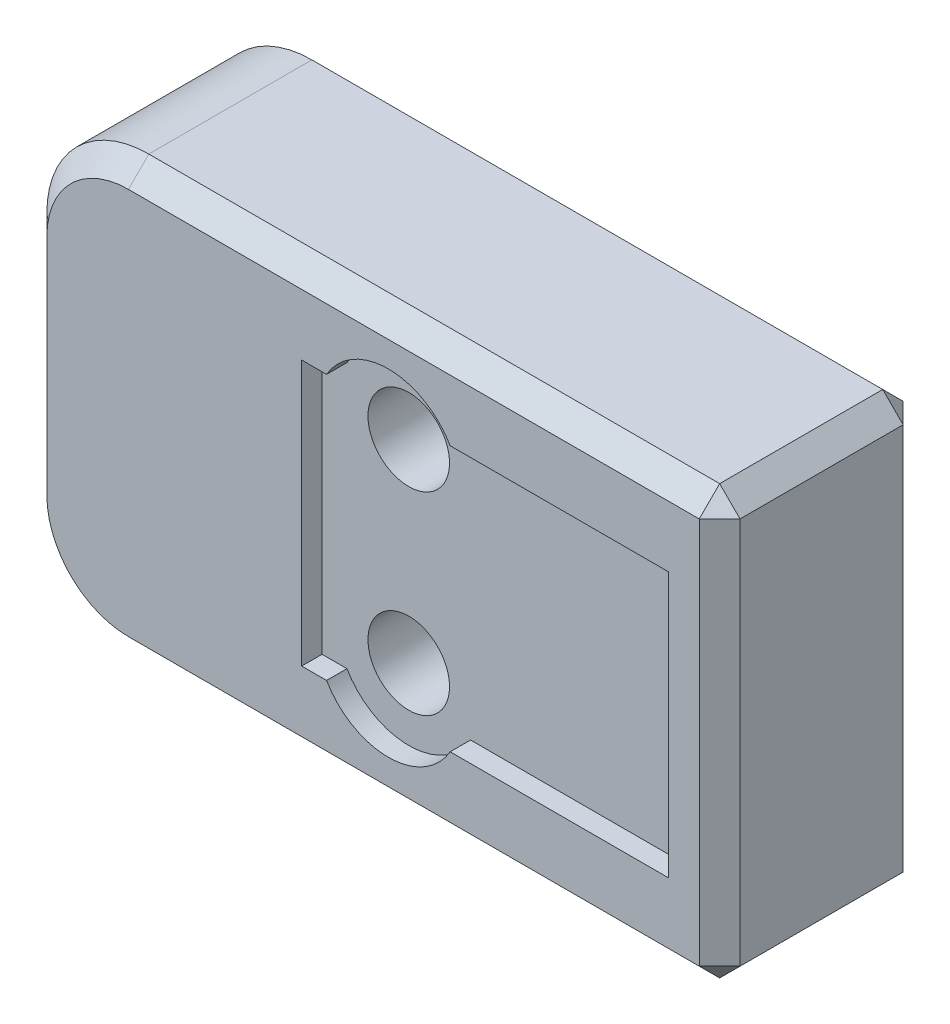
ISO-10303-21;
HEADER;
FILE_DESCRIPTION(('STEP AP214'),'2;1');
FILE_NAME('part.step','',(''),(''),'','','');
FILE_SCHEMA(('AUTOMOTIVE_DESIGN { 1 0 10303 214 1 1 1 1 }'));
ENDSEC;
DATA;
#1=APPLICATION_CONTEXT('core data for automotive mechanical design processes');
#2=APPLICATION_PROTOCOL_DEFINITION('international standard','automotive_design',2000,#1);
#3=PRODUCT_CONTEXT('',#1,'mechanical');
#4=PRODUCT('Part','Part','',(#3));
#5=PRODUCT_RELATED_PRODUCT_CATEGORY('part','',(#4));
#6=PRODUCT_DEFINITION_FORMATION('','',#4);
#7=PRODUCT_DEFINITION_CONTEXT('part definition',#1,'design');
#8=PRODUCT_DEFINITION('design','',#6,#7);
#9=PRODUCT_DEFINITION_SHAPE('','',#8);
#10=(LENGTH_UNIT() NAMED_UNIT(*) SI_UNIT(.MILLI.,.METRE.));
#11=(NAMED_UNIT(*) PLANE_ANGLE_UNIT() SI_UNIT($,.RADIAN.));
#12=(NAMED_UNIT(*) SI_UNIT($,.STERADIAN.) SOLID_ANGLE_UNIT());
#13=UNCERTAINTY_MEASURE_WITH_UNIT(LENGTH_MEASURE(1.E-05),#10,'distance_accuracy_value','');
#14=(GEOMETRIC_REPRESENTATION_CONTEXT(3) GLOBAL_UNCERTAINTY_ASSIGNED_CONTEXT((#13)) GLOBAL_UNIT_ASSIGNED_CONTEXT((#10,
#11,#12)) REPRESENTATION_CONTEXT('',''));
#15=CARTESIAN_POINT('',(0.,0.,0.));
#16=DIRECTION('',(0.,0.,1.));
#17=DIRECTION('',(1.,0.,0.));
#18=AXIS2_PLACEMENT_3D('',#15,#16,#17);
#19=CARTESIAN_POINT('',(-3.5,6.5,9.));
#20=DIRECTION('',(0.,-1.,0.));
#21=DIRECTION('',(1.,0.,0.));
#22=AXIS2_PLACEMENT_3D('',#19,#20,#21);
#23=PLANE('',#22);
#24=DIRECTION('',(0.,0.,-1.));
#25=VECTOR('',#24,1.);
#26=CARTESIAN_POINT('',(-2.28108891324553,6.5,10.));
#27=LINE('',#26,#25);
#28=CARTESIAN_POINT('',(-2.28108891324553,6.5,10.));
#29=VERTEX_POINT('',#28);
#30=CARTESIAN_POINT('',(-2.28108891324553,6.5,9.));
#31=VERTEX_POINT('',#30);
#32=EDGE_CURVE('E219',#29,#31,#27,.T.);
#33=ORIENTED_EDGE('',*,*,#32,.F.);
#34=DIRECTION('',(1.,0.,0.));
#35=VECTOR('',#34,1.);
#36=CARTESIAN_POINT('',(-3.5,6.5,10.));
#37=LINE('',#36,#35);
#38=CARTESIAN_POINT('',(-3.5,6.5,10.));
#39=VERTEX_POINT('',#38);
#40=EDGE_CURVE('E233',#39,#29,#37,.T.);
#41=ORIENTED_EDGE('',*,*,#40,.F.);
#42=DIRECTION('',(0.,0.,1.));
#43=VECTOR('',#42,1.);
#44=CARTESIAN_POINT('',(-3.5,6.5,9.));
#45=LINE('',#44,#43);
#46=CARTESIAN_POINT('',(-3.5,6.5,9.));
#47=VERTEX_POINT('',#46);
#48=EDGE_CURVE('E268',#47,#39,#45,.T.);
#49=ORIENTED_EDGE('',*,*,#48,.F.);
#50=DIRECTION('',(1.,0.,0.));
#51=VECTOR('',#50,1.);
#52=CARTESIAN_POINT('',(-3.5,6.5,9.));
#53=LINE('',#52,#51);
#54=EDGE_CURVE('E236',#47,#31,#53,.T.);
#55=ORIENTED_EDGE('',*,*,#54,.T.);
#56=EDGE_LOOP('',(#33,#41,#49,#55));
#57=FACE_BOUND('',#56,.T.);
#58=ADVANCED_FACE('F66',(#57),#23,.T.);
#59=CARTESIAN_POINT('',(14.5,-6.5,9.));
#60=DIRECTION('',(0.,1.,0.));
#61=DIRECTION('',(0.,0.,1.));
#62=AXIS2_PLACEMENT_3D('',#59,#60,#61);
#63=PLANE('',#62);
#64=DIRECTION('',(0.,0.,-1.));
#65=VECTOR('',#64,1.);
#66=CARTESIAN_POINT('',(3.78108891324554,-6.5,10.));
#67=LINE('',#66,#65);
#68=CARTESIAN_POINT('',(3.78108891324554,-6.5,10.));
#69=VERTEX_POINT('',#68);
#70=CARTESIAN_POINT('',(3.78108891324554,-6.5,9.));
#71=VERTEX_POINT('',#70);
#72=EDGE_CURVE('E343',#69,#71,#67,.T.);
#73=ORIENTED_EDGE('',*,*,#72,.F.);
#74=DIRECTION('',(-1.,0.,0.));
#75=VECTOR('',#74,1.);
#76=CARTESIAN_POINT('',(14.5,-6.5,10.));
#77=LINE('',#76,#75);
#78=CARTESIAN_POINT('',(14.5,-6.5,10.));
#79=VERTEX_POINT('',#78);
#80=EDGE_CURVE('E256',#79,#69,#77,.T.);
#81=ORIENTED_EDGE('',*,*,#80,.F.);
#82=DIRECTION('',(0.,0.,1.));
#83=VECTOR('',#82,1.);
#84=CARTESIAN_POINT('',(14.5,-6.5,9.));
#85=LINE('',#84,#83);
#86=CARTESIAN_POINT('',(14.5,-6.5,9.));
#87=VERTEX_POINT('',#86);
#88=EDGE_CURVE('E261',#87,#79,#85,.T.);
#89=ORIENTED_EDGE('',*,*,#88,.F.);
#90=DIRECTION('',(-1.,0.,0.));
#91=VECTOR('',#90,1.);
#92=CARTESIAN_POINT('',(14.5,-6.5,9.));
#93=LINE('',#92,#91);
#94=EDGE_CURVE('E414',#87,#71,#93,.T.);
#95=ORIENTED_EDGE('',*,*,#94,.T.);
#96=EDGE_LOOP('',(#73,#81,#89,#95));
#97=FACE_BOUND('',#96,.T.);
#98=ADVANCED_FACE('F435',(#97),#63,.T.);
#99=CARTESIAN_POINT('',(0.,0.,10.));
#100=DIRECTION('',(0.,0.,-1.));
#101=DIRECTION('',(-1.,0.,0.));
#102=AXIS2_PLACEMENT_3D('',#99,#100,#101);
#103=PLANE('',#102);
#104=DIRECTION('',(1.,0.,0.));
#105=VECTOR('',#104,1.);
#106=CARTESIAN_POINT('',(17.,-9.5,10.));
#107=LINE('',#106,#105);
#108=CARTESIAN_POINT('',(-12.,-9.5,10.));
#109=VERTEX_POINT('',#108);
#110=CARTESIAN_POINT('',(16.,-9.5,10.));
#111=VERTEX_POINT('',#110);
#112=EDGE_CURVE('E318',#109,#111,#107,.T.);
#113=ORIENTED_EDGE('',*,*,#112,.T.);
#114=DIRECTION('',(0.,1.,0.));
#115=VECTOR('',#114,1.);
#116=CARTESIAN_POINT('',(16.,10.5,10.));
#117=LINE('',#116,#115);
#118=CARTESIAN_POINT('',(16.,9.5,10.));
#119=VERTEX_POINT('',#118);
#120=EDGE_CURVE('E328',#111,#119,#117,.T.);
#121=ORIENTED_EDGE('',*,*,#120,.T.);
#122=DIRECTION('',(-1.,0.,0.));
#123=VECTOR('',#122,1.);
#124=CARTESIAN_POINT('',(-12.,9.5,10.));
#125=LINE('',#124,#123);
#126=CARTESIAN_POINT('',(-12.,9.5,10.));
#127=VERTEX_POINT('',#126);
#128=EDGE_CURVE('E326',#119,#127,#125,.T.);
#129=ORIENTED_EDGE('',*,*,#128,.T.);
#130=CARTESIAN_POINT('',(-12.,5.5,10.));
#131=DIRECTION('',(0.,0.,-1.));
#132=DIRECTION('',(-1.,0.,0.));
#133=AXIS2_PLACEMENT_3D('',#130,#131,#132);
#134=CIRCLE('',#133,4.);
#135=CARTESIAN_POINT('',(-16.,5.5,10.));
#136=VERTEX_POINT('',#135);
#137=EDGE_CURVE('E324',#127,#136,#134,.F.);
#138=ORIENTED_EDGE('',*,*,#137,.T.);
#139=DIRECTION('',(0.,-1.,0.));
#140=VECTOR('',#139,1.);
#141=CARTESIAN_POINT('',(-16.,-5.5,10.));
#142=LINE('',#141,#140);
#143=CARTESIAN_POINT('',(-16.,-5.5,10.));
#144=VERTEX_POINT('',#143);
#145=EDGE_CURVE('E322',#136,#144,#142,.T.);
#146=ORIENTED_EDGE('',*,*,#145,.T.);
#147=CARTESIAN_POINT('',(-12.,-5.5,10.));
#148=DIRECTION('',(0.,0.,-1.));
#149=DIRECTION('',(-1.,0.,0.));
#150=AXIS2_PLACEMENT_3D('',#147,#148,#149);
#151=CIRCLE('',#150,4.);
#152=EDGE_CURVE('E320',#144,#109,#151,.F.);
#153=ORIENTED_EDGE('',*,*,#152,.T.);
#154=EDGE_LOOP('',(#113,#121,#129,#138,#146,#153));
#155=FACE_BOUND('',#154,.T.);
#156=ORIENTED_EDGE('',*,*,#40,.T.);
#157=CARTESIAN_POINT('',(0.75,4.75,10.));
#158=DIRECTION('',(0.,0.,-1.));
#159=DIRECTION('',(0.,-1.,0.));
#160=AXIS2_PLACEMENT_3D('',#157,#158,#159);
#161=CIRCLE('',#160,3.5);
#162=CARTESIAN_POINT('',(3.78108891324553,6.5,10.));
#163=VERTEX_POINT('',#162);
#164=EDGE_CURVE('E216',#29,#163,#161,.T.);
#165=ORIENTED_EDGE('',*,*,#164,.T.);
#166=CARTESIAN_POINT('',(14.5,6.5,10.));
#167=VERTEX_POINT('',#166);
#168=EDGE_CURVE('E244',#163,#167,#37,.T.);
#169=ORIENTED_EDGE('',*,*,#168,.T.);
#170=DIRECTION('',(0.,-1.,0.));
#171=VECTOR('',#170,1.);
#172=CARTESIAN_POINT('',(14.5,6.5,10.));
#173=LINE('',#172,#171);
#174=EDGE_CURVE('E243',#167,#79,#173,.T.);
#175=ORIENTED_EDGE('',*,*,#174,.T.);
#176=ORIENTED_EDGE('',*,*,#80,.T.);
#177=CARTESIAN_POINT('',(0.75,-4.75,10.));
#178=DIRECTION('',(0.,0.,-1.));
#179=DIRECTION('',(0.,-1.,0.));
#180=AXIS2_PLACEMENT_3D('',#177,#178,#179);
#181=CIRCLE('',#180,3.5);
#182=CARTESIAN_POINT('',(-2.28108891324553,-6.5,10.));
#183=VERTEX_POINT('',#182);
#184=EDGE_CURVE('E237',#69,#183,#181,.T.);
#185=ORIENTED_EDGE('',*,*,#184,.T.);
#186=CARTESIAN_POINT('',(-3.5,-6.5,10.));
#187=VERTEX_POINT('',#186);
#188=EDGE_CURVE('E260',#183,#187,#77,.T.);
#189=ORIENTED_EDGE('',*,*,#188,.T.);
#190=DIRECTION('',(0.,1.,0.));
#191=VECTOR('',#190,1.);
#192=CARTESIAN_POINT('',(-3.5,-6.5,10.));
#193=LINE('',#192,#191);
#194=EDGE_CURVE('E241',#187,#39,#193,.T.);
#195=ORIENTED_EDGE('',*,*,#194,.T.);
#196=EDGE_LOOP('',(#156,#165,#169,#175,#176,#185,#189,#195));
#197=FACE_BOUND('',#196,.T.);
#198=ADVANCED_FACE('F239',(#155,#197),#103,.F.);
#199=CARTESIAN_POINT('',(-17.,-10.5,10.));
#200=DIRECTION('',(-1.,0.,0.));
#201=DIRECTION('',(0.,0.,1.));
#202=AXIS2_PLACEMENT_3D('',#199,#200,#201);
#203=PLANE('',#202);
#204=DIRECTION('',(0.,0.,-1.));
#205=VECTOR('',#204,1.);
#206=CARTESIAN_POINT('',(-17.,5.5,10.));
#207=LINE('',#206,#205);
#208=CARTESIAN_POINT('',(-17.,5.5,9.));
#209=VERTEX_POINT('',#208);
#210=CARTESIAN_POINT('',(-17.,5.5,1.));
#211=VERTEX_POINT('',#210);
#212=EDGE_CURVE('E278',#209,#211,#207,.T.);
#213=ORIENTED_EDGE('',*,*,#212,.T.);
#214=DIRECTION('',(0.,-1.,0.));
#215=VECTOR('',#214,1.);
#216=CARTESIAN_POINT('',(-17.,-10.5,1.));
#217=LINE('',#216,#215);
#218=CARTESIAN_POINT('',(-17.,-5.5,1.));
#219=VERTEX_POINT('',#218);
#220=EDGE_CURVE('E88',#211,#219,#217,.T.);
#221=ORIENTED_EDGE('',*,*,#220,.T.);
#222=DIRECTION('',(0.,0.,-1.));
#223=VECTOR('',#222,1.);
#224=CARTESIAN_POINT('',(-17.,-5.5,10.));
#225=LINE('',#224,#223);
#226=CARTESIAN_POINT('',(-17.,-5.5,9.));
#227=VERTEX_POINT('',#226);
#228=EDGE_CURVE('E276',#219,#227,#225,.F.);
#229=ORIENTED_EDGE('',*,*,#228,.T.);
#230=DIRECTION('',(0.,1.,0.));
#231=VECTOR('',#230,1.);
#232=CARTESIAN_POINT('',(-17.,5.5,9.));
#233=LINE('',#232,#231);
#234=EDGE_CURVE('E335',#227,#209,#233,.T.);
#235=ORIENTED_EDGE('',*,*,#234,.T.);
#236=EDGE_LOOP('',(#213,#221,#229,#235));
#237=FACE_BOUND('',#236,.T.);
#238=ADVANCED_FACE('F488',(#237),#203,.T.);
#239=CARTESIAN_POINT('',(-17.,10.5,10.));
#240=DIRECTION('',(0.,1.,0.));
#241=DIRECTION('',(0.,0.,1.));
#242=AXIS2_PLACEMENT_3D('',#239,#240,#241);
#243=PLANE('',#242);
#244=DIRECTION('',(0.,0.,-1.));
#245=VECTOR('',#244,1.);
#246=CARTESIAN_POINT('',(16.,10.5,10.));
#247=LINE('',#246,#245);
#248=CARTESIAN_POINT('',(16.,10.5,9.));
#249=VERTEX_POINT('',#248);
#250=CARTESIAN_POINT('',(16.,10.5,1.));
#251=VERTEX_POINT('',#250);
#252=EDGE_CURVE('E285',#249,#251,#247,.T.);
#253=ORIENTED_EDGE('',*,*,#252,.T.);
#254=DIRECTION('',(-1.,0.,0.));
#255=VECTOR('',#254,1.);
#256=CARTESIAN_POINT('',(-17.,10.5,1.));
#257=LINE('',#256,#255);
#258=CARTESIAN_POINT('',(-12.,10.5,1.));
#259=VERTEX_POINT('',#258);
#260=EDGE_CURVE('E288',#251,#259,#257,.T.);
#261=ORIENTED_EDGE('',*,*,#260,.T.);
#262=DIRECTION('',(0.,0.,-1.));
#263=VECTOR('',#262,1.);
#264=CARTESIAN_POINT('',(-12.,10.5,10.));
#265=LINE('',#264,#263);
#266=CARTESIAN_POINT('',(-12.,10.5,9.));
#267=VERTEX_POINT('',#266);
#268=EDGE_CURVE('E280',#259,#267,#265,.F.);
#269=ORIENTED_EDGE('',*,*,#268,.T.);
#270=DIRECTION('',(1.,0.,0.));
#271=VECTOR('',#270,1.);
#272=CARTESIAN_POINT('',(17.,10.5,9.));
#273=LINE('',#272,#271);
#274=EDGE_CURVE('E283',#267,#249,#273,.T.);
#275=ORIENTED_EDGE('',*,*,#274,.T.);
#276=EDGE_LOOP('',(#253,#261,#269,#275));
#277=FACE_BOUND('',#276,.T.);
#278=ADVANCED_FACE('F500',(#277),#243,.T.);
#279=CARTESIAN_POINT('',(17.,10.5,10.));
#280=DIRECTION('',(1.,0.,0.));
#281=DIRECTION('',(0.,0.,-1.));
#282=AXIS2_PLACEMENT_3D('',#279,#280,#281);
#283=PLANE('',#282);
#284=DIRECTION('',(0.,1.,0.));
#285=VECTOR('',#284,1.);
#286=CARTESIAN_POINT('',(17.,10.5,1.));
#287=LINE('',#286,#285);
#288=CARTESIAN_POINT('',(17.,-9.5,1.));
#289=VERTEX_POINT('',#288);
#290=CARTESIAN_POINT('',(17.,9.5,1.));
#291=VERTEX_POINT('',#290);
#292=EDGE_CURVE('E294',#289,#291,#287,.T.);
#293=ORIENTED_EDGE('',*,*,#292,.T.);
#294=DIRECTION('',(0.,0.,1.));
#295=VECTOR('',#294,1.);
#296=CARTESIAN_POINT('',(17.,9.5,10.));
#297=LINE('',#296,#295);
#298=CARTESIAN_POINT('',(17.,9.5,9.));
#299=VERTEX_POINT('',#298);
#300=EDGE_CURVE('E296',#291,#299,#297,.T.);
#301=ORIENTED_EDGE('',*,*,#300,.T.);
#302=DIRECTION('',(0.,-1.,0.));
#303=VECTOR('',#302,1.);
#304=CARTESIAN_POINT('',(17.,-10.5,9.));
#305=LINE('',#304,#303);
#306=CARTESIAN_POINT('',(17.,-9.5,9.));
#307=VERTEX_POINT('',#306);
#308=EDGE_CURVE('E290',#299,#307,#305,.T.);
#309=ORIENTED_EDGE('',*,*,#308,.T.);
#310=DIRECTION('',(0.,0.,-1.));
#311=VECTOR('',#310,1.);
#312=CARTESIAN_POINT('',(17.,-9.5,10.));
#313=LINE('',#312,#311);
#314=EDGE_CURVE('E292',#307,#289,#313,.T.);
#315=ORIENTED_EDGE('',*,*,#314,.T.);
#316=EDGE_LOOP('',(#293,#301,#309,#315));
#317=FACE_BOUND('',#316,.T.);
#318=ADVANCED_FACE('F496',(#317),#283,.T.);
#319=CARTESIAN_POINT('',(17.,-10.5,10.));
#320=DIRECTION('',(0.,-1.,0.));
#321=DIRECTION('',(0.,0.,-1.));
#322=AXIS2_PLACEMENT_3D('',#319,#320,#321);
#323=PLANE('',#322);
#324=DIRECTION('',(0.,0.,-1.));
#325=VECTOR('',#324,1.);
#326=CARTESIAN_POINT('',(-12.,-10.5,10.));
#327=LINE('',#326,#325);
#328=CARTESIAN_POINT('',(-12.,-10.5,9.));
#329=VERTEX_POINT('',#328);
#330=CARTESIAN_POINT('',(-12.,-10.5,1.));
#331=VERTEX_POINT('',#330);
#332=EDGE_CURVE('E273',#329,#331,#327,.T.);
#333=ORIENTED_EDGE('',*,*,#332,.T.);
#334=DIRECTION('',(1.,0.,0.));
#335=VECTOR('',#334,1.);
#336=CARTESIAN_POINT('',(17.,-10.5,1.));
#337=LINE('',#336,#335);
#338=CARTESIAN_POINT('',(16.,-10.5,1.));
#339=VERTEX_POINT('',#338);
#340=EDGE_CURVE('E316',#331,#339,#337,.T.);
#341=ORIENTED_EDGE('',*,*,#340,.T.);
#342=DIRECTION('',(0.,0.,1.));
#343=VECTOR('',#342,1.);
#344=CARTESIAN_POINT('',(16.,-10.5,10.));
#345=LINE('',#344,#343);
#346=CARTESIAN_POINT('',(16.,-10.5,9.));
#347=VERTEX_POINT('',#346);
#348=EDGE_CURVE('E314',#339,#347,#345,.T.);
#349=ORIENTED_EDGE('',*,*,#348,.T.);
#350=DIRECTION('',(-1.,0.,0.));
#351=VECTOR('',#350,1.);
#352=CARTESIAN_POINT('',(-12.,-10.5,9.));
#353=LINE('',#352,#351);
#354=EDGE_CURVE('E312',#347,#329,#353,.T.);
#355=ORIENTED_EDGE('',*,*,#354,.T.);
#356=EDGE_LOOP('',(#333,#341,#349,#355));
#357=FACE_BOUND('',#356,.T.);
#358=ADVANCED_FACE('F492',(#357),#323,.T.);
#359=CARTESIAN_POINT('',(0.,0.,0.));
#360=DIRECTION('',(0.,0.,-1.));
#361=DIRECTION('',(-1.,0.,0.));
#362=AXIS2_PLACEMENT_3D('',#359,#360,#361);
#363=PLANE('',#362);
#364=DIRECTION('',(1.,0.,0.));
#365=VECTOR('',#364,1.);
#366=CARTESIAN_POINT('',(0.,9.5,0.));
#367=LINE('',#366,#365);
#368=CARTESIAN_POINT('',(-12.,9.5,0.));
#369=VERTEX_POINT('',#368);
#370=CARTESIAN_POINT('',(16.,9.5,0.));
#371=VERTEX_POINT('',#370);
#372=EDGE_CURVE('E307',#369,#371,#367,.T.);
#373=ORIENTED_EDGE('',*,*,#372,.T.);
#374=DIRECTION('',(0.,-1.,0.));
#375=VECTOR('',#374,1.);
#376=CARTESIAN_POINT('',(16.,0.,0.));
#377=LINE('',#376,#375);
#378=CARTESIAN_POINT('',(16.,-9.5,0.));
#379=VERTEX_POINT('',#378);
#380=EDGE_CURVE('E309',#371,#379,#377,.T.);
#381=ORIENTED_EDGE('',*,*,#380,.T.);
#382=DIRECTION('',(-1.,0.,0.));
#383=VECTOR('',#382,1.);
#384=CARTESIAN_POINT('',(0.,-9.5,0.));
#385=LINE('',#384,#383);
#386=CARTESIAN_POINT('',(-12.,-9.5,0.));
#387=VERTEX_POINT('',#386);
#388=EDGE_CURVE('E299',#379,#387,#385,.T.);
#389=ORIENTED_EDGE('',*,*,#388,.T.);
#390=CARTESIAN_POINT('',(-12.,-5.5,0.));
#391=DIRECTION('',(0.,0.,-1.));
#392=DIRECTION('',(-1.,0.,0.));
#393=AXIS2_PLACEMENT_3D('',#390,#391,#392);
#394=CIRCLE('',#393,4.);
#395=CARTESIAN_POINT('',(-16.,-5.5,0.));
#396=VERTEX_POINT('',#395);
#397=EDGE_CURVE('E301',#387,#396,#394,.T.);
#398=ORIENTED_EDGE('',*,*,#397,.T.);
#399=DIRECTION('',(0.,1.,0.));
#400=VECTOR('',#399,1.);
#401=CARTESIAN_POINT('',(-16.,0.,0.));
#402=LINE('',#401,#400);
#403=CARTESIAN_POINT('',(-16.,5.5,0.));
#404=VERTEX_POINT('',#403);
#405=EDGE_CURVE('E303',#396,#404,#402,.T.);
#406=ORIENTED_EDGE('',*,*,#405,.T.);
#407=CARTESIAN_POINT('',(-12.,5.5,0.));
#408=DIRECTION('',(0.,0.,-1.));
#409=DIRECTION('',(-1.,0.,0.));
#410=AXIS2_PLACEMENT_3D('',#407,#408,#409);
#411=CIRCLE('',#410,4.);
#412=EDGE_CURVE('E305',#404,#369,#411,.T.);
#413=ORIENTED_EDGE('',*,*,#412,.T.);
#414=EDGE_LOOP('',(#373,#381,#389,#398,#406,#413));
#415=FACE_BOUND('',#414,.T.);
#416=ADVANCED_FACE('F484',(#415),#363,.T.);
#417=DIRECTION('',(0.,0.,-1.));
#418=VECTOR('',#417,1.);
#419=CARTESIAN_POINT('',(-2.28108891324553,-6.5,10.));
#420=LINE('',#419,#418);
#421=CARTESIAN_POINT('',(-2.28108891324553,-6.5,9.));
#422=VERTEX_POINT('',#421);
#423=EDGE_CURVE('E411',#422,#183,#420,.F.);
#424=ORIENTED_EDGE('',*,*,#423,.F.);
#425=CARTESIAN_POINT('',(-3.5,-6.5,9.));
#426=VERTEX_POINT('',#425);
#427=EDGE_CURVE('E250',#422,#426,#93,.T.);
#428=ORIENTED_EDGE('',*,*,#427,.T.);
#429=DIRECTION('',(0.,0.,1.));
#430=VECTOR('',#429,1.);
#431=CARTESIAN_POINT('',(-3.5,-6.5,9.));
#432=LINE('',#431,#430);
#433=EDGE_CURVE('E270',#426,#187,#432,.T.);
#434=ORIENTED_EDGE('',*,*,#433,.T.);
#435=ORIENTED_EDGE('',*,*,#188,.F.);
#436=EDGE_LOOP('',(#424,#428,#434,#435));
#437=FACE_BOUND('',#436,.T.);
#438=ADVANCED_FACE('F408',(#437),#63,.T.);
#439=CARTESIAN_POINT('',(-3.5,-6.5,9.));
#440=DIRECTION('',(1.,0.,0.));
#441=DIRECTION('',(0.,1.,0.));
#442=AXIS2_PLACEMENT_3D('',#439,#440,#441);
#443=PLANE('',#442);
#444=ORIENTED_EDGE('',*,*,#194,.F.);
#445=ORIENTED_EDGE('',*,*,#433,.F.);
#446=DIRECTION('',(0.,1.,0.));
#447=VECTOR('',#446,1.);
#448=CARTESIAN_POINT('',(-3.5,-6.5,9.));
#449=LINE('',#448,#447);
#450=EDGE_CURVE('E415',#426,#47,#449,.T.);
#451=ORIENTED_EDGE('',*,*,#450,.T.);
#452=ORIENTED_EDGE('',*,*,#48,.T.);
#453=EDGE_LOOP('',(#444,#445,#451,#452));
#454=FACE_BOUND('',#453,.T.);
#455=ADVANCED_FACE('F407',(#454),#443,.T.);
#456=DIRECTION('',(0.,0.,-1.));
#457=VECTOR('',#456,1.);
#458=CARTESIAN_POINT('',(3.78108891324553,6.5,10.));
#459=LINE('',#458,#457);
#460=CARTESIAN_POINT('',(3.78108891324553,6.5,9.));
#461=VERTEX_POINT('',#460);
#462=EDGE_CURVE('E222',#461,#163,#459,.F.);
#463=ORIENTED_EDGE('',*,*,#462,.F.);
#464=CARTESIAN_POINT('',(14.5,6.5,9.));
#465=VERTEX_POINT('',#464);
#466=EDGE_CURVE('E419',#461,#465,#53,.T.);
#467=ORIENTED_EDGE('',*,*,#466,.T.);
#468=DIRECTION('',(0.,0.,1.));
#469=VECTOR('',#468,1.);
#470=CARTESIAN_POINT('',(14.5,6.5,9.));
#471=LINE('',#470,#469);
#472=EDGE_CURVE('E264',#465,#167,#471,.T.);
#473=ORIENTED_EDGE('',*,*,#472,.T.);
#474=ORIENTED_EDGE('',*,*,#168,.F.);
#475=EDGE_LOOP('',(#463,#467,#473,#474));
#476=FACE_BOUND('',#475,.T.);
#477=ADVANCED_FACE('F466',(#476),#23,.T.);
#478=CARTESIAN_POINT('',(14.5,6.5,9.));
#479=DIRECTION('',(-1.,0.,0.));
#480=DIRECTION('',(0.,-1.,0.));
#481=AXIS2_PLACEMENT_3D('',#478,#479,#480);
#482=PLANE('',#481);
#483=ORIENTED_EDGE('',*,*,#174,.F.);
#484=ORIENTED_EDGE('',*,*,#472,.F.);
#485=DIRECTION('',(0.,-1.,0.));
#486=VECTOR('',#485,1.);
#487=CARTESIAN_POINT('',(14.5,6.5,9.));
#488=LINE('',#487,#486);
#489=EDGE_CURVE('E265',#465,#87,#488,.T.);
#490=ORIENTED_EDGE('',*,*,#489,.T.);
#491=ORIENTED_EDGE('',*,*,#88,.T.);
#492=EDGE_LOOP('',(#483,#484,#490,#491));
#493=FACE_BOUND('',#492,.T.);
#494=ADVANCED_FACE('F431',(#493),#482,.T.);
#495=CARTESIAN_POINT('',(0.,0.,9.));
#496=DIRECTION('',(0.,0.,-1.));
#497=DIRECTION('',(-1.,0.,0.));
#498=AXIS2_PLACEMENT_3D('',#495,#496,#497);
#499=PLANE('',#498);
#500=ORIENTED_EDGE('',*,*,#466,.F.);
#501=CARTESIAN_POINT('',(0.75,4.75,9.));
#502=DIRECTION('',(0.,0.,1.));
#503=DIRECTION('',(0.,-1.,0.));
#504=AXIS2_PLACEMENT_3D('',#501,#502,#503);
#505=CIRCLE('',#504,3.5);
#506=EDGE_CURVE('E226',#461,#31,#505,.T.);
#507=ORIENTED_EDGE('',*,*,#506,.T.);
#508=ORIENTED_EDGE('',*,*,#54,.F.);
#509=ORIENTED_EDGE('',*,*,#450,.F.);
#510=ORIENTED_EDGE('',*,*,#427,.F.);
#511=CARTESIAN_POINT('',(0.75,-4.75,9.));
#512=DIRECTION('',(0.,0.,1.));
#513=DIRECTION('',(0.,-1.,0.));
#514=AXIS2_PLACEMENT_3D('',#511,#512,#513);
#515=CIRCLE('',#514,3.5);
#516=EDGE_CURVE('E436',#422,#71,#515,.T.);
#517=ORIENTED_EDGE('',*,*,#516,.T.);
#518=ORIENTED_EDGE('',*,*,#94,.F.);
#519=ORIENTED_EDGE('',*,*,#489,.F.);
#520=EDGE_LOOP('',(#500,#507,#508,#509,#510,#517,#518,#519));
#521=FACE_BOUND('',#520,.T.);
#522=CARTESIAN_POINT('',(0.75,4.75,9.));
#523=DIRECTION('',(0.,0.,-1.));
#524=DIRECTION('',(-1.,0.,0.));
#525=AXIS2_PLACEMENT_3D('',#522,#523,#524);
#526=CIRCLE('',#525,2.);
#527=CARTESIAN_POINT('',(-1.25,4.75,9.));
#528=VERTEX_POINT('',#527);
#529=EDGE_CURVE('E227',#528,#528,#526,.T.);
#530=ORIENTED_EDGE('',*,*,#529,.T.);
#531=EDGE_LOOP('',(#530));
#532=FACE_BOUND('',#531,.T.);
#533=CARTESIAN_POINT('',(0.75,-4.75,9.));
#534=DIRECTION('',(0.,0.,1.));
#535=DIRECTION('',(1.,0.,0.));
#536=AXIS2_PLACEMENT_3D('',#533,#534,#535);
#537=CIRCLE('',#536,2.);
#538=CARTESIAN_POINT('',(2.75,-4.75,9.));
#539=VERTEX_POINT('',#538);
#540=EDGE_CURVE('E448',#539,#539,#537,.T.);
#541=ORIENTED_EDGE('',*,*,#540,.F.);
#542=EDGE_LOOP('',(#541));
#543=FACE_BOUND('',#542,.T.);
#544=ADVANCED_FACE('F417',(#521,#532,#543),#499,.F.);
#545=CARTESIAN_POINT('',(-12.,-5.5,10.));
#546=DIRECTION('',(0.,0.,-1.));
#547=DIRECTION('',(-1.,0.,0.));
#548=AXIS2_PLACEMENT_3D('',#545,#546,#547);
#549=CYLINDRICAL_SURFACE('',#548,5.);
#550=ORIENTED_EDGE('',*,*,#228,.F.);
#551=CARTESIAN_POINT('',(-12.,-5.5,1.));
#552=DIRECTION('',(0.,0.,-1.));
#553=DIRECTION('',(-1.,0.,0.));
#554=AXIS2_PLACEMENT_3D('',#551,#552,#553);
#555=CIRCLE('',#554,5.);
#556=EDGE_CURVE('E74',#219,#331,#555,.F.);
#557=ORIENTED_EDGE('',*,*,#556,.T.);
#558=ORIENTED_EDGE('',*,*,#332,.F.);
#559=CARTESIAN_POINT('',(-12.,-5.5,9.));
#560=DIRECTION('',(0.,0.,-1.));
#561=DIRECTION('',(-1.,0.,0.));
#562=AXIS2_PLACEMENT_3D('',#559,#560,#561);
#563=CIRCLE('',#562,5.);
#564=EDGE_CURVE('E81',#329,#227,#563,.T.);
#565=ORIENTED_EDGE('',*,*,#564,.T.);
#566=EDGE_LOOP('',(#550,#557,#558,#565));
#567=FACE_BOUND('',#566,.T.);
#568=ADVANCED_FACE('F456',(#567),#549,.T.);
#569=CARTESIAN_POINT('',(-12.,5.5,10.));
#570=DIRECTION('',(0.,0.,-1.));
#571=DIRECTION('',(-1.,0.,0.));
#572=AXIS2_PLACEMENT_3D('',#569,#570,#571);
#573=CYLINDRICAL_SURFACE('',#572,5.);
#574=ORIENTED_EDGE('',*,*,#268,.F.);
#575=CARTESIAN_POINT('',(-12.,5.5,1.));
#576=DIRECTION('',(0.,0.,-1.));
#577=DIRECTION('',(-1.,0.,0.));
#578=AXIS2_PLACEMENT_3D('',#575,#576,#577);
#579=CIRCLE('',#578,5.);
#580=EDGE_CURVE('E333',#259,#211,#579,.F.);
#581=ORIENTED_EDGE('',*,*,#580,.T.);
#582=ORIENTED_EDGE('',*,*,#212,.F.);
#583=CARTESIAN_POINT('',(-12.,5.5,9.));
#584=DIRECTION('',(0.,0.,-1.));
#585=DIRECTION('',(-1.,0.,0.));
#586=AXIS2_PLACEMENT_3D('',#583,#584,#585);
#587=CIRCLE('',#586,5.);
#588=EDGE_CURVE('E331',#209,#267,#587,.T.);
#589=ORIENTED_EDGE('',*,*,#588,.T.);
#590=EDGE_LOOP('',(#574,#581,#582,#589));
#591=FACE_BOUND('',#590,.T.);
#592=ADVANCED_FACE('F463',(#591),#573,.T.);
#593=CARTESIAN_POINT('',(-12.,-5.5,10.));
#594=DIRECTION('',(0.,0.,-1.));
#595=DIRECTION('',(-1.,0.,0.));
#596=AXIS2_PLACEMENT_3D('',#593,#594,#595);
#597=CONICAL_SURFACE('',#596,4.,0.785398163397449);
#598=DIRECTION('',(0.707106781186548,0.,0.707106781186547));
#599=VECTOR('',#598,1.);
#600=CARTESIAN_POINT('',(-17.,-5.5,9.));
#601=LINE('',#600,#599);
#602=EDGE_CURVE('E391',#227,#144,#601,.T.);
#603=ORIENTED_EDGE('',*,*,#602,.F.);
#604=ORIENTED_EDGE('',*,*,#564,.F.);
#605=DIRECTION('',(0.,-0.707106781186548,-0.707106781186547));
#606=VECTOR('',#605,1.);
#607=CARTESIAN_POINT('',(-12.,-9.5,10.));
#608=LINE('',#607,#606);
#609=EDGE_CURVE('E393',#109,#329,#608,.T.);
#610=ORIENTED_EDGE('',*,*,#609,.F.);
#611=ORIENTED_EDGE('',*,*,#152,.F.);
#612=EDGE_LOOP('',(#603,#604,#610,#611));
#613=FACE_BOUND('',#612,.T.);
#614=ADVANCED_FACE('F68',(#613),#597,.T.);
#615=CARTESIAN_POINT('',(-12.,-5.5,0.));
#616=DIRECTION('',(0.,0.,1.));
#617=DIRECTION('',(1.,0.,0.));
#618=AXIS2_PLACEMENT_3D('',#615,#616,#617);
#619=CONICAL_SURFACE('',#618,4.,0.785398163397449);
#620=DIRECTION('',(0.,0.707106781186548,-0.707106781186547));
#621=VECTOR('',#620,1.);
#622=CARTESIAN_POINT('',(-12.,-10.5,1.));
#623=LINE('',#622,#621);
#624=EDGE_CURVE('E385',#331,#387,#623,.T.);
#625=ORIENTED_EDGE('',*,*,#624,.F.);
#626=ORIENTED_EDGE('',*,*,#556,.F.);
#627=DIRECTION('',(-0.707106781186548,0.,0.707106781186547));
#628=VECTOR('',#627,1.);
#629=CARTESIAN_POINT('',(-16.,-5.5,0.));
#630=LINE('',#629,#628);
#631=EDGE_CURVE('E388',#396,#219,#630,.T.);
#632=ORIENTED_EDGE('',*,*,#631,.F.);
#633=ORIENTED_EDGE('',*,*,#397,.F.);
#634=EDGE_LOOP('',(#625,#626,#632,#633));
#635=FACE_BOUND('',#634,.T.);
#636=ADVANCED_FACE('F573',(#635),#619,.T.);
#637=CARTESIAN_POINT('',(17.,-10.5,9.));
#638=DIRECTION('',(0.,-0.707106781186547,0.707106781186548));
#639=DIRECTION('',(1.,0.,0.));
#640=AXIS2_PLACEMENT_3D('',#637,#638,#639);
#641=PLANE('',#640);
#642=ORIENTED_EDGE('',*,*,#609,.T.);
#643=ORIENTED_EDGE('',*,*,#354,.F.);
#644=DIRECTION('',(0.,-0.707106781186548,-0.707106781186547));
#645=VECTOR('',#644,1.);
#646=CARTESIAN_POINT('',(16.,-10.5,9.));
#647=LINE('',#646,#645);
#648=EDGE_CURVE('E379',#111,#347,#647,.T.);
#649=ORIENTED_EDGE('',*,*,#648,.F.);
#650=ORIENTED_EDGE('',*,*,#112,.F.);
#651=EDGE_LOOP('',(#642,#643,#649,#650));
#652=FACE_BOUND('',#651,.T.);
#653=ADVANCED_FACE('F570',(#652),#641,.T.);
#654=CARTESIAN_POINT('',(-17.,-10.5,9.));
#655=DIRECTION('',(-0.707106781186547,0.,0.707106781186548));
#656=DIRECTION('',(0.,-1.,0.));
#657=AXIS2_PLACEMENT_3D('',#654,#655,#656);
#658=PLANE('',#657);
#659=ORIENTED_EDGE('',*,*,#602,.T.);
#660=ORIENTED_EDGE('',*,*,#145,.F.);
#661=DIRECTION('',(0.707106781186548,0.,0.707106781186547));
#662=VECTOR('',#661,1.);
#663=CARTESIAN_POINT('',(-17.,5.5,9.));
#664=LINE('',#663,#662);
#665=EDGE_CURVE('E376',#209,#136,#664,.T.);
#666=ORIENTED_EDGE('',*,*,#665,.F.);
#667=ORIENTED_EDGE('',*,*,#234,.F.);
#668=EDGE_LOOP('',(#659,#660,#666,#667));
#669=FACE_BOUND('',#668,.T.);
#670=ADVANCED_FACE('F566',(#669),#658,.T.);
#671=CARTESIAN_POINT('',(-16.,0.,0.));
#672=DIRECTION('',(0.707106781186547,0.,0.707106781186548));
#673=DIRECTION('',(0.,1.,0.));
#674=AXIS2_PLACEMENT_3D('',#671,#672,#673);
#675=PLANE('',#674);
#676=ORIENTED_EDGE('',*,*,#631,.T.);
#677=ORIENTED_EDGE('',*,*,#220,.F.);
#678=DIRECTION('',(-0.707106781186548,0.,0.707106781186547));
#679=VECTOR('',#678,1.);
#680=CARTESIAN_POINT('',(-16.,5.5,0.));
#681=LINE('',#680,#679);
#682=EDGE_CURVE('E373',#404,#211,#681,.T.);
#683=ORIENTED_EDGE('',*,*,#682,.F.);
#684=ORIENTED_EDGE('',*,*,#405,.F.);
#685=EDGE_LOOP('',(#676,#677,#683,#684));
#686=FACE_BOUND('',#685,.T.);
#687=ADVANCED_FACE('F562',(#686),#675,.F.);
#688=CARTESIAN_POINT('',(0.,-9.5,0.));
#689=DIRECTION('',(0.,0.707106781186547,0.707106781186548));
#690=DIRECTION('',(-1.,0.,0.));
#691=AXIS2_PLACEMENT_3D('',#688,#689,#690);
#692=PLANE('',#691);
#693=ORIENTED_EDGE('',*,*,#624,.T.);
#694=ORIENTED_EDGE('',*,*,#388,.F.);
#695=DIRECTION('',(0.,-0.707106781186548,0.707106781186547));
#696=VECTOR('',#695,1.);
#697=CARTESIAN_POINT('',(16.,-9.5,0.));
#698=LINE('',#697,#696);
#699=EDGE_CURVE('E370',#339,#379,#698,.F.);
#700=ORIENTED_EDGE('',*,*,#699,.F.);
#701=ORIENTED_EDGE('',*,*,#340,.F.);
#702=EDGE_LOOP('',(#693,#694,#700,#701));
#703=FACE_BOUND('',#702,.T.);
#704=ADVANCED_FACE('F558',(#703),#692,.F.);
#705=CARTESIAN_POINT('',(17.,-9.5,10.));
#706=DIRECTION('',(-0.707106781186548,0.707106781186548,0.));
#707=DIRECTION('',(0.,0.,-1.));
#708=AXIS2_PLACEMENT_3D('',#705,#706,#707);
#709=PLANE('',#708);
#710=DIRECTION('',(-0.707106781186548,-0.707106781186548,0.));
#711=VECTOR('',#710,1.);
#712=CARTESIAN_POINT('',(16.,-10.5,9.));
#713=LINE('',#712,#711);
#714=EDGE_CURVE('E382',#347,#307,#713,.F.);
#715=ORIENTED_EDGE('',*,*,#714,.F.);
#716=ORIENTED_EDGE('',*,*,#348,.F.);
#717=DIRECTION('',(0.707106781186548,0.707106781186548,0.));
#718=VECTOR('',#717,1.);
#719=CARTESIAN_POINT('',(16.5,-10.,1.));
#720=LINE('',#719,#718);
#721=EDGE_CURVE('E367',#289,#339,#720,.F.);
#722=ORIENTED_EDGE('',*,*,#721,.F.);
#723=ORIENTED_EDGE('',*,*,#314,.F.);
#724=EDGE_LOOP('',(#715,#716,#722,#723));
#725=FACE_BOUND('',#724,.T.);
#726=ADVANCED_FACE('F554',(#725),#709,.F.);
#727=CARTESIAN_POINT('',(16.,-10.5,9.));
#728=DIRECTION('',(0.577350269189625,-0.577350269189625,0.577350269189627));
#729=DIRECTION('',(0.707106781186548,0.,-0.707106781186547));
#730=AXIS2_PLACEMENT_3D('',#727,#728,#729);
#731=PLANE('',#730);
#732=ORIENTED_EDGE('',*,*,#648,.T.);
#733=ORIENTED_EDGE('',*,*,#714,.T.);
#734=DIRECTION('',(-0.707106781186548,0.,0.707106781186547));
#735=VECTOR('',#734,1.);
#736=CARTESIAN_POINT('',(16.5,-9.5,9.5));
#737=LINE('',#736,#735);
#738=EDGE_CURVE('E364',#111,#307,#737,.F.);
#739=ORIENTED_EDGE('',*,*,#738,.F.);
#740=EDGE_LOOP('',(#732,#733,#739));
#741=FACE_BOUND('',#740,.T.);
#742=ADVANCED_FACE('F550',(#741),#731,.T.);
#743=CARTESIAN_POINT('',(-12.,5.5,10.));
#744=DIRECTION('',(0.,0.,-1.));
#745=DIRECTION('',(-1.,0.,0.));
#746=AXIS2_PLACEMENT_3D('',#743,#744,#745);
#747=CONICAL_SURFACE('',#746,4.,0.785398163397449);
#748=ORIENTED_EDGE('',*,*,#665,.T.);
#749=ORIENTED_EDGE('',*,*,#137,.F.);
#750=DIRECTION('',(0.,-0.707106781186548,0.707106781186547));
#751=VECTOR('',#750,1.);
#752=CARTESIAN_POINT('',(-12.,10.5,9.));
#753=LINE('',#752,#751);
#754=EDGE_CURVE('E361',#267,#127,#753,.T.);
#755=ORIENTED_EDGE('',*,*,#754,.F.);
#756=ORIENTED_EDGE('',*,*,#588,.F.);
#757=EDGE_LOOP('',(#748,#749,#755,#756));
#758=FACE_BOUND('',#757,.T.);
#759=ADVANCED_FACE('F546',(#758),#747,.T.);
#760=CARTESIAN_POINT('',(-12.,5.5,0.));
#761=DIRECTION('',(0.,0.,1.));
#762=DIRECTION('',(1.,0.,0.));
#763=AXIS2_PLACEMENT_3D('',#760,#761,#762);
#764=CONICAL_SURFACE('',#763,4.,0.785398163397449);
#765=ORIENTED_EDGE('',*,*,#682,.T.);
#766=ORIENTED_EDGE('',*,*,#580,.F.);
#767=DIRECTION('',(0.,0.707106781186548,0.707106781186547));
#768=VECTOR('',#767,1.);
#769=CARTESIAN_POINT('',(-12.,9.5,0.));
#770=LINE('',#769,#768);
#771=EDGE_CURVE('E358',#369,#259,#770,.T.);
#772=ORIENTED_EDGE('',*,*,#771,.F.);
#773=ORIENTED_EDGE('',*,*,#412,.F.);
#774=EDGE_LOOP('',(#765,#766,#772,#773));
#775=FACE_BOUND('',#774,.T.);
#776=ADVANCED_FACE('F542',(#775),#764,.T.);
#777=CARTESIAN_POINT('',(16.,-9.5,0.));
#778=DIRECTION('',(0.577350269189625,-0.577350269189625,-0.577350269189627));
#779=DIRECTION('',(-0.707106781186548,0.,-0.707106781186547));
#780=AXIS2_PLACEMENT_3D('',#777,#778,#779);
#781=PLANE('',#780);
#782=ORIENTED_EDGE('',*,*,#721,.T.);
#783=ORIENTED_EDGE('',*,*,#699,.T.);
#784=DIRECTION('',(-0.707106781186548,0.,-0.707106781186547));
#785=VECTOR('',#784,1.);
#786=CARTESIAN_POINT('',(16.,-9.5,0.));
#787=LINE('',#786,#785);
#788=EDGE_CURVE('E356',#289,#379,#787,.T.);
#789=ORIENTED_EDGE('',*,*,#788,.F.);
#790=EDGE_LOOP('',(#782,#783,#789));
#791=FACE_BOUND('',#790,.T.);
#792=ADVANCED_FACE('F538',(#791),#781,.T.);
#793=CARTESIAN_POINT('',(17.,10.5,9.));
#794=DIRECTION('',(0.707106781186547,0.,0.707106781186548));
#795=DIRECTION('',(0.,1.,0.));
#796=AXIS2_PLACEMENT_3D('',#793,#794,#795);
#797=PLANE('',#796);
#798=ORIENTED_EDGE('',*,*,#738,.T.);
#799=ORIENTED_EDGE('',*,*,#308,.F.);
#800=DIRECTION('',(0.707106781186548,0.,-0.707106781186547));
#801=VECTOR('',#800,1.);
#802=CARTESIAN_POINT('',(17.,9.5,9.));
#803=LINE('',#802,#801);
#804=EDGE_CURVE('E353',#119,#299,#803,.T.);
#805=ORIENTED_EDGE('',*,*,#804,.F.);
#806=ORIENTED_EDGE('',*,*,#120,.F.);
#807=EDGE_LOOP('',(#798,#799,#805,#806));
#808=FACE_BOUND('',#807,.T.);
#809=ADVANCED_FACE('F534',(#808),#797,.T.);
#810=CARTESIAN_POINT('',(-17.,10.5,9.));
#811=DIRECTION('',(0.,0.707106781186547,0.707106781186548));
#812=DIRECTION('',(-1.,0.,0.));
#813=AXIS2_PLACEMENT_3D('',#810,#811,#812);
#814=PLANE('',#813);
#815=ORIENTED_EDGE('',*,*,#754,.T.);
#816=ORIENTED_EDGE('',*,*,#128,.F.);
#817=DIRECTION('',(0.,-0.707106781186548,0.707106781186547));
#818=VECTOR('',#817,1.);
#819=CARTESIAN_POINT('',(16.,10.,9.5));
#820=LINE('',#819,#818);
#821=EDGE_CURVE('E351',#249,#119,#820,.T.);
#822=ORIENTED_EDGE('',*,*,#821,.F.);
#823=ORIENTED_EDGE('',*,*,#274,.F.);
#824=EDGE_LOOP('',(#815,#816,#822,#823));
#825=FACE_BOUND('',#824,.T.);
#826=ADVANCED_FACE('F530',(#825),#814,.T.);
#827=CARTESIAN_POINT('',(0.,9.5,0.));
#828=DIRECTION('',(0.,-0.707106781186547,0.707106781186548));
#829=DIRECTION('',(1.,0.,0.));
#830=AXIS2_PLACEMENT_3D('',#827,#828,#829);
#831=PLANE('',#830);
#832=ORIENTED_EDGE('',*,*,#771,.T.);
#833=ORIENTED_EDGE('',*,*,#260,.F.);
#834=DIRECTION('',(0.,-0.707106781186548,-0.707106781186547));
#835=VECTOR('',#834,1.);
#836=CARTESIAN_POINT('',(16.,10.5,1.));
#837=LINE('',#836,#835);
#838=EDGE_CURVE('E348',#371,#251,#837,.F.);
#839=ORIENTED_EDGE('',*,*,#838,.F.);
#840=ORIENTED_EDGE('',*,*,#372,.F.);
#841=EDGE_LOOP('',(#832,#833,#839,#840));
#842=FACE_BOUND('',#841,.T.);
#843=ADVANCED_FACE('F526',(#842),#831,.F.);
#844=CARTESIAN_POINT('',(16.,0.,0.));
#845=DIRECTION('',(-0.707106781186547,0.,0.707106781186548));
#846=DIRECTION('',(0.,-1.,0.));
#847=AXIS2_PLACEMENT_3D('',#844,#845,#846);
#848=PLANE('',#847);
#849=ORIENTED_EDGE('',*,*,#788,.T.);
#850=ORIENTED_EDGE('',*,*,#380,.F.);
#851=DIRECTION('',(0.707106781186548,0.,0.707106781186547));
#852=VECTOR('',#851,1.);
#853=CARTESIAN_POINT('',(16.5,9.5,0.5));
#854=LINE('',#853,#852);
#855=EDGE_CURVE('E345',#291,#371,#854,.F.);
#856=ORIENTED_EDGE('',*,*,#855,.F.);
#857=ORIENTED_EDGE('',*,*,#292,.F.);
#858=EDGE_LOOP('',(#849,#850,#856,#857));
#859=FACE_BOUND('',#858,.T.);
#860=ADVANCED_FACE('F522',(#859),#848,.F.);
#861=CARTESIAN_POINT('',(17.,9.5,9.));
#862=DIRECTION('',(0.577350269189625,0.577350269189625,0.577350269189627));
#863=DIRECTION('',(0.707106781186548,0.,-0.707106781186547));
#864=AXIS2_PLACEMENT_3D('',#861,#862,#863);
#865=PLANE('',#864);
#866=ORIENTED_EDGE('',*,*,#821,.T.);
#867=ORIENTED_EDGE('',*,*,#804,.T.);
#868=DIRECTION('',(0.707106781186548,-0.707106781186548,0.));
#869=VECTOR('',#868,1.);
#870=CARTESIAN_POINT('',(17.,9.5,9.));
#871=LINE('',#870,#869);
#872=EDGE_CURVE('E342',#249,#299,#871,.T.);
#873=ORIENTED_EDGE('',*,*,#872,.F.);
#874=EDGE_LOOP('',(#866,#867,#873));
#875=FACE_BOUND('',#874,.T.);
#876=ADVANCED_FACE('F518',(#875),#865,.T.);
#877=CARTESIAN_POINT('',(16.,10.5,1.));
#878=DIRECTION('',(0.577350269189625,0.577350269189625,-0.577350269189627));
#879=DIRECTION('',(-0.707106781186548,0.,-0.707106781186547));
#880=AXIS2_PLACEMENT_3D('',#877,#878,#879);
#881=PLANE('',#880);
#882=ORIENTED_EDGE('',*,*,#855,.T.);
#883=ORIENTED_EDGE('',*,*,#838,.T.);
#884=DIRECTION('',(-0.707106781186548,0.707106781186548,0.));
#885=VECTOR('',#884,1.);
#886=CARTESIAN_POINT('',(16.,10.5,1.));
#887=LINE('',#886,#885);
#888=EDGE_CURVE('E340',#291,#251,#887,.T.);
#889=ORIENTED_EDGE('',*,*,#888,.F.);
#890=EDGE_LOOP('',(#882,#883,#889));
#891=FACE_BOUND('',#890,.T.);
#892=ADVANCED_FACE('F514',(#891),#881,.T.);
#893=CARTESIAN_POINT('',(16.,10.5,10.));
#894=DIRECTION('',(-0.707106781186548,-0.707106781186548,0.));
#895=DIRECTION('',(0.,0.,-1.));
#896=AXIS2_PLACEMENT_3D('',#893,#894,#895);
#897=PLANE('',#896);
#898=ORIENTED_EDGE('',*,*,#872,.T.);
#899=ORIENTED_EDGE('',*,*,#300,.F.);
#900=ORIENTED_EDGE('',*,*,#888,.T.);
#901=ORIENTED_EDGE('',*,*,#252,.F.);
#902=EDGE_LOOP('',(#898,#899,#900,#901));
#903=FACE_BOUND('',#902,.T.);
#904=ADVANCED_FACE('F510',(#903),#897,.F.);
#905=CARTESIAN_POINT('',(0.75,-4.75,10.));
#906=DIRECTION('',(0.,0.,-1.));
#907=DIRECTION('',(0.,-1.,0.));
#908=AXIS2_PLACEMENT_3D('',#905,#906,#907);
#909=CYLINDRICAL_SURFACE('',#908,3.5);
#910=ORIENTED_EDGE('',*,*,#72,.T.);
#911=ORIENTED_EDGE('',*,*,#516,.F.);
#912=ORIENTED_EDGE('',*,*,#423,.T.);
#913=ORIENTED_EDGE('',*,*,#184,.F.);
#914=EDGE_LOOP('',(#910,#911,#912,#913));
#915=FACE_BOUND('',#914,.T.);
#916=ADVANCED_FACE('F513',(#915),#909,.F.);
#917=CARTESIAN_POINT('',(0.75,4.75,10.));
#918=DIRECTION('',(0.,0.,-1.));
#919=DIRECTION('',(0.,-1.,0.));
#920=AXIS2_PLACEMENT_3D('',#917,#918,#919);
#921=CYLINDRICAL_SURFACE('',#920,3.5);
#922=ORIENTED_EDGE('',*,*,#32,.T.);
#923=ORIENTED_EDGE('',*,*,#506,.F.);
#924=ORIENTED_EDGE('',*,*,#462,.T.);
#925=ORIENTED_EDGE('',*,*,#164,.F.);
#926=EDGE_LOOP('',(#922,#923,#924,#925));
#927=FACE_BOUND('',#926,.T.);
#928=ADVANCED_FACE('F218',(#927),#921,.F.);
#929=CARTESIAN_POINT('',(0.75,4.75,15.3639610306789));
#930=DIRECTION('',(0.,0.,-1.));
#931=DIRECTION('',(-1.,0.,0.));
#932=AXIS2_PLACEMENT_3D('',#929,#930,#931);
#933=CYLINDRICAL_SURFACE('',#932,2.);
#934=CARTESIAN_POINT('',(0.75,4.75,2.65));
#935=DIRECTION('',(0.,0.,1.));
#936=DIRECTION('',(1.,0.,0.));
#937=AXIS2_PLACEMENT_3D('',#934,#935,#936);
#938=CIRCLE('',#937,2.);
#939=CARTESIAN_POINT('',(-1.25,4.75,2.65));
#940=VERTEX_POINT('',#939);
#941=EDGE_CURVE('E445',#940,#940,#938,.T.);
#942=CARTESIAN_POINT('',(-1.25,4.75,9.));
#943=CARTESIAN_POINT('',(-1.25,4.75,8.93385416666667));
#944=CARTESIAN_POINT('',(-1.25,4.75,8.86770833333333));
#945=CARTESIAN_POINT('',(-1.25,4.75,8.73541666666667));
#946=CARTESIAN_POINT('',(-1.25,4.75,8.66927083333333));
#947=CARTESIAN_POINT('',(-1.25,4.75,8.53697916666667));
#948=CARTESIAN_POINT('',(-1.25,4.75,8.47083333333333));
#949=CARTESIAN_POINT('',(-1.25,4.75,8.33854166666667));
#950=CARTESIAN_POINT('',(-1.25,4.75,8.27239583333333));
#951=CARTESIAN_POINT('',(-1.25,4.75,8.14010416666667));
#952=CARTESIAN_POINT('',(-1.25,4.75,8.07395833333333));
#953=CARTESIAN_POINT('',(-1.25,4.75,7.94166666666667));
#954=CARTESIAN_POINT('',(-1.25,4.75,7.87552083333333));
#955=CARTESIAN_POINT('',(-1.25,4.75,7.74322916666667));
#956=CARTESIAN_POINT('',(-1.25,4.75,7.67708333333333));
#957=CARTESIAN_POINT('',(-1.25,4.75,7.54479166666667));
#958=CARTESIAN_POINT('',(-1.25,4.75,7.47864583333333));
#959=CARTESIAN_POINT('',(-1.25,4.75,7.34635416666667));
#960=CARTESIAN_POINT('',(-1.25,4.75,7.28020833333333));
#961=CARTESIAN_POINT('',(-1.25,4.75,7.14791666666667));
#962=CARTESIAN_POINT('',(-1.25,4.75,7.08177083333333));
#963=CARTESIAN_POINT('',(-1.25,4.75,6.94947916666667));
#964=CARTESIAN_POINT('',(-1.25,4.75,6.88333333333333));
#965=CARTESIAN_POINT('',(-1.25,4.75,6.75104166666667));
#966=CARTESIAN_POINT('',(-1.25,4.75,6.68489583333333));
#967=CARTESIAN_POINT('',(-1.25,4.75,6.55260416666667));
#968=CARTESIAN_POINT('',(-1.25,4.75,6.48645833333333));
#969=CARTESIAN_POINT('',(-1.25,4.75,6.35416666666667));
#970=CARTESIAN_POINT('',(-1.25,4.75,6.28802083333333));
#971=CARTESIAN_POINT('',(-1.25,4.75,6.15572916666667));
#972=CARTESIAN_POINT('',(-1.25,4.75,6.08958333333333));
#973=CARTESIAN_POINT('',(-1.25,4.75,5.95729166666667));
#974=CARTESIAN_POINT('',(-1.25,4.75,5.89114583333333));
#975=CARTESIAN_POINT('',(-1.25,4.75,5.75885416666667));
#976=CARTESIAN_POINT('',(-1.25,4.75,5.69270833333333));
#977=CARTESIAN_POINT('',(-1.25,4.75,5.56041666666667));
#978=CARTESIAN_POINT('',(-1.25,4.75,5.49427083333333));
#979=CARTESIAN_POINT('',(-1.25,4.75,5.36197916666667));
#980=CARTESIAN_POINT('',(-1.25,4.75,5.29583333333333));
#981=CARTESIAN_POINT('',(-1.25,4.75,5.16354166666667));
#982=CARTESIAN_POINT('',(-1.25,4.75,5.09739583333333));
#983=CARTESIAN_POINT('',(-1.25,4.75,4.96510416666667));
#984=CARTESIAN_POINT('',(-1.25,4.75,4.89895833333333));
#985=CARTESIAN_POINT('',(-1.25,4.75,4.76666666666667));
#986=CARTESIAN_POINT('',(-1.25,4.75,4.70052083333333));
#987=CARTESIAN_POINT('',(-1.25,4.75,4.56822916666667));
#988=CARTESIAN_POINT('',(-1.25,4.75,4.50208333333333));
#989=CARTESIAN_POINT('',(-1.25,4.75,4.36979166666667));
#990=CARTESIAN_POINT('',(-1.25,4.75,4.30364583333333));
#991=CARTESIAN_POINT('',(-1.25,4.75,4.17135416666667));
#992=CARTESIAN_POINT('',(-1.25,4.75,4.10520833333333));
#993=CARTESIAN_POINT('',(-1.25,4.75,3.97291666666667));
#994=CARTESIAN_POINT('',(-1.25,4.75,3.90677083333333));
#995=CARTESIAN_POINT('',(-1.25,4.75,3.77447916666667));
#996=CARTESIAN_POINT('',(-1.25,4.75,3.70833333333333));
#997=CARTESIAN_POINT('',(-1.25,4.75,3.57604166666667));
#998=CARTESIAN_POINT('',(-1.25,4.75,3.50989583333333));
#999=CARTESIAN_POINT('',(-1.25,4.75,3.37760416666667));
#1000=CARTESIAN_POINT('',(-1.25,4.75,3.31145833333333));
#1001=CARTESIAN_POINT('',(-1.25,4.75,3.17916666666667));
#1002=CARTESIAN_POINT('',(-1.25,4.75,3.11302083333333));
#1003=CARTESIAN_POINT('',(-1.25,4.75,2.98072916666667));
#1004=CARTESIAN_POINT('',(-1.25,4.75,2.91458333333333));
#1005=CARTESIAN_POINT('',(-1.25,4.75,2.78229166666667));
#1006=CARTESIAN_POINT('',(-1.25,4.75,2.71614583333333));
#1007=CARTESIAN_POINT('',(-1.25,4.75,2.65));
#1008=B_SPLINE_CURVE_WITH_KNOTS('',3,(#942,#943,#944,#945,#946,#947,#948,#949,#950,#951,#952,
#953,#954,#955,#956,#957,#958,#959,#960,#961,#962,#963,#964,#965,#966,#967,#968,#969,#970,#971,
#972,#973,#974,#975,#976,#977,#978,#979,#980,#981,#982,#983,#984,#985,#986,#987,#988,#989,#990,
#991,#992,#993,#994,#995,#996,#997,#998,#999,#1000,#1001,#1002,#1003,#1004,#1005,#1006,#1007),
.UNSPECIFIED.,.F.,.F.,(4,2,2,2,2,2,2,2,2,2,2,2,2,2,2,2,2,2,2,2,2,2,2,2,2,2,2,2,2,2,2,2,4),(0.,
0.198437500000001,0.396875000000001,0.5953125,0.793750000000001,0.992187500000002,1.190625,
1.3890625,1.5875,1.7859375,1.984375,2.1828125,2.38125,2.5796875,2.778125,2.9765625,3.175,
3.3734375,3.571875,3.7703125,3.96875,4.1671875,4.365625,4.5640625,4.7625,4.9609375,5.159375,
5.3578125,5.55625,5.7546875,5.953125,6.1515625,6.35),.UNSPECIFIED.);
#1009=EDGE_CURVE('BSEAM672',#528,#940,#1008,.T.);
#1010=ORIENTED_EDGE('',*,*,#529,.F.);
#1011=ORIENTED_EDGE('',*,*,#941,.F.);
#1012=ORIENTED_EDGE('',*,*,#1009,.T.);
#1013=ORIENTED_EDGE('',*,*,#1009,.F.);
#1014=EDGE_LOOP('',(#1010,#1012,#1011,#1013));
#1015=FACE_BOUND('',#1014,.T.);
#1016=ADVANCED_FACE('F672',(#1015),#933,.F.);
#1017=CARTESIAN_POINT('',(0.75,4.75,2.65));
#1018=DIRECTION('',(0.,0.,-1.));
#1019=DIRECTION('',(-1.,0.,0.));
#1020=AXIS2_PLACEMENT_3D('',#1017,#1018,#1019);
#1021=PLANE('',#1020);
#1022=ORIENTED_EDGE('',*,*,#941,.T.);
#1023=EDGE_LOOP('',(#1022));
#1024=FACE_BOUND('',#1023,.T.);
#1025=ADVANCED_FACE('F676',(#1024),#1021,.F.);
#1026=CARTESIAN_POINT('',(0.75,-4.75,-0.00200000000000027));
#1027=DIRECTION('',(0.,0.,1.));
#1028=DIRECTION('',(1.,0.,0.));
#1029=AXIS2_PLACEMENT_3D('',#1026,#1027,#1028);
#1030=CYLINDRICAL_SURFACE('',#1029,2.);
#1031=ORIENTED_EDGE('',*,*,#540,.T.);
#1032=EDGE_LOOP('',(#1031));
#1033=FACE_BOUND('',#1032,.T.);
#1034=CARTESIAN_POINT('',(0.75,-4.75,2.65));
#1035=DIRECTION('',(0.,0.,-1.));
#1036=DIRECTION('',(-1.,0.,0.));
#1037=AXIS2_PLACEMENT_3D('',#1034,#1035,#1036);
#1038=CIRCLE('',#1037,2.);
#1039=CARTESIAN_POINT('',(-1.25,-4.75,2.65));
#1040=VERTEX_POINT('',#1039);
#1041=EDGE_CURVE('E12',#1040,#1040,#1038,.T.);
#1042=ORIENTED_EDGE('',*,*,#1041,.T.);
#1043=EDGE_LOOP('',(#1042));
#1044=FACE_BOUND('',#1043,.T.);
#1045=ADVANCED_FACE('F452',(#1033,#1044),#1030,.F.);
#1046=CARTESIAN_POINT('',(0.75,-4.75,2.65));
#1047=DIRECTION('',(0.,0.,-1.));
#1048=DIRECTION('',(-1.,0.,0.));
#1049=AXIS2_PLACEMENT_3D('',#1046,#1047,#1048);
#1050=PLANE('',#1049);
#1051=ORIENTED_EDGE('',*,*,#1041,.F.);
#1052=EDGE_LOOP('',(#1051));
#1053=FACE_BOUND('',#1052,.T.);
#1054=ADVANCED_FACE('F702',(#1053),#1050,.F.);
#1055=CLOSED_SHELL('',(#58,#98,#198,#238,#278,#318,#358,#416,#438,#455,#477,#494,#544,#568,#592,
#614,#636,#653,#670,#687,#704,#726,#742,#759,#776,#792,#809,#826,#843,#860,#876,#892,#904,#916,
#928,#1016,#1025,#1045,#1054));
#1056=MANIFOLD_SOLID_BREP('B2',#1055);
#1057=ADVANCED_BREP_SHAPE_REPRESENTATION('',(#18,#1056),#14);
#1058=SHAPE_DEFINITION_REPRESENTATION(#9,#1057);
ENDSEC;
END-ISO-10303-21;
